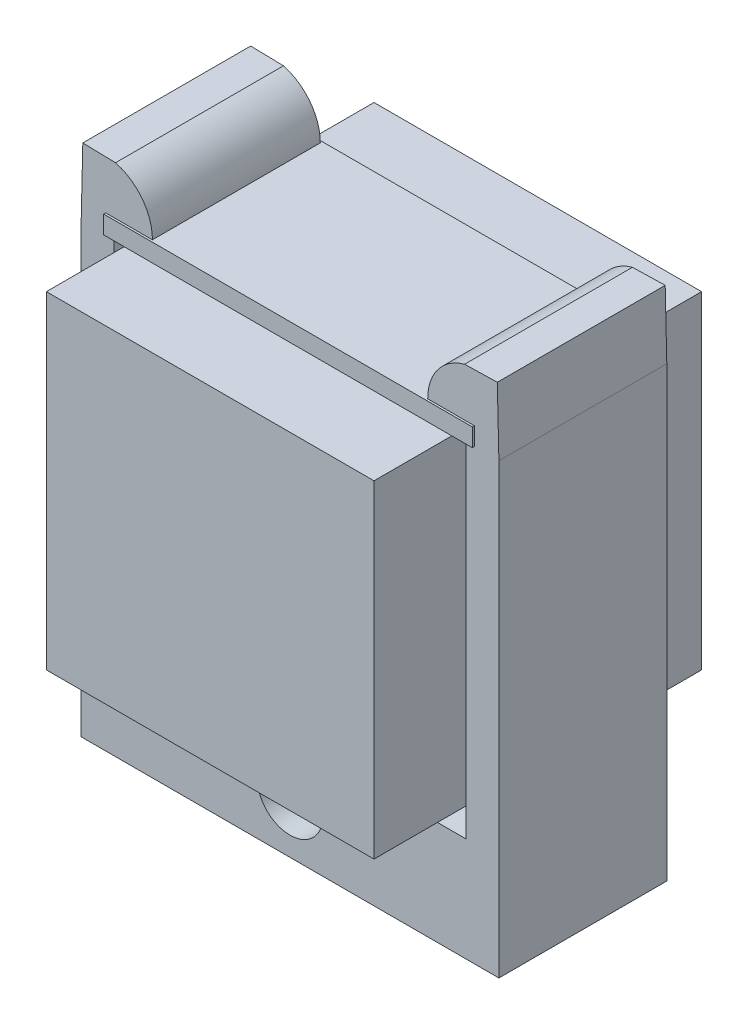
ISO-10303-21;
HEADER;
FILE_DESCRIPTION(('STEP AP214'),'2;1');
FILE_NAME('part.step','',(''),(''),'','','');
FILE_SCHEMA(('AUTOMOTIVE_DESIGN { 1 0 10303 214 1 1 1 1 }'));
ENDSEC;
DATA;
#1=APPLICATION_CONTEXT('core data for automotive mechanical design processes');
#2=APPLICATION_PROTOCOL_DEFINITION('international standard','automotive_design',2000,#1);
#3=PRODUCT_CONTEXT('',#1,'mechanical');
#4=PRODUCT('Part','Part','',(#3));
#5=PRODUCT_RELATED_PRODUCT_CATEGORY('part','',(#4));
#6=PRODUCT_DEFINITION_FORMATION('','',#4);
#7=PRODUCT_DEFINITION_CONTEXT('part definition',#1,'design');
#8=PRODUCT_DEFINITION('design','',#6,#7);
#9=PRODUCT_DEFINITION_SHAPE('','',#8);
#10=(LENGTH_UNIT() NAMED_UNIT(*) SI_UNIT(.MILLI.,.METRE.));
#11=(NAMED_UNIT(*) PLANE_ANGLE_UNIT() SI_UNIT($,.RADIAN.));
#12=(NAMED_UNIT(*) SI_UNIT($,.STERADIAN.) SOLID_ANGLE_UNIT());
#13=UNCERTAINTY_MEASURE_WITH_UNIT(LENGTH_MEASURE(1.E-05),#10,'distance_accuracy_value','');
#14=(GEOMETRIC_REPRESENTATION_CONTEXT(3) GLOBAL_UNCERTAINTY_ASSIGNED_CONTEXT((#13)) GLOBAL_UNIT_ASSIGNED_CONTEXT((#10,
#11,#12)) REPRESENTATION_CONTEXT('',''));
#15=CARTESIAN_POINT('',(0.,0.,0.));
#16=DIRECTION('',(0.,0.,1.));
#17=DIRECTION('',(1.,0.,0.));
#18=AXIS2_PLACEMENT_3D('',#15,#16,#17);
#19=CARTESIAN_POINT('',(-22.8808210284441,2.23350018556867,10.25));
#20=DIRECTION('',(0.,0.,-1.));
#21=DIRECTION('',(-1.,0.,0.));
#22=AXIS2_PLACEMENT_3D('',#19,#20,#21);
#23=CYLINDRICAL_SURFACE('',#22,6.07659216068548);
#24=CARTESIAN_POINT('',(-22.8808210284441,2.23350018556867,-10.25));
#25=DIRECTION('',(0.,0.,1.));
#26=DIRECTION('',(1.,0.,0.));
#27=AXIS2_PLACEMENT_3D('',#24,#25,#26);
#28=CIRCLE('',#27,6.07659216068548);
#29=CARTESIAN_POINT('',(-21.3059505258639,8.10246561291676,-10.25));
#30=VERTEX_POINT('',#29);
#31=CARTESIAN_POINT('',(-16.8059505258639,2.0888604116977,-10.25));
#32=VERTEX_POINT('',#31);
#33=EDGE_CURVE('E200',#30,#32,#28,.F.);
#34=ORIENTED_EDGE('',*,*,#33,.F.);
#35=DIRECTION('',(0.,0.,-1.));
#36=VECTOR('',#35,1.);
#37=CARTESIAN_POINT('',(-21.3059505258639,8.10246561291676,10.25));
#38=LINE('',#37,#36);
#39=CARTESIAN_POINT('',(-21.3059505258639,8.10246561291676,10.25));
#40=VERTEX_POINT('',#39);
#41=EDGE_CURVE('E12',#40,#30,#38,.T.);
#42=ORIENTED_EDGE('',*,*,#41,.F.);
#43=CARTESIAN_POINT('',(-22.8808210284441,2.23350018556867,10.25));
#44=DIRECTION('',(0.,0.,1.));
#45=DIRECTION('',(1.,0.,0.));
#46=AXIS2_PLACEMENT_3D('',#43,#44,#45);
#47=CIRCLE('',#46,6.07659216068548);
#48=CARTESIAN_POINT('',(-16.8059505258639,2.0888604116977,10.25));
#49=VERTEX_POINT('',#48);
#50=EDGE_CURVE('E243',#40,#49,#47,.F.);
#51=ORIENTED_EDGE('',*,*,#50,.T.);
#52=DIRECTION('',(0.,0.,-1.));
#53=VECTOR('',#52,1.);
#54=CARTESIAN_POINT('',(-16.8059505258639,2.0888604116977,10.25));
#55=LINE('',#54,#53);
#56=EDGE_CURVE('E71',#49,#32,#55,.T.);
#57=ORIENTED_EDGE('',*,*,#56,.T.);
#58=EDGE_LOOP('',(#34,#42,#51,#57));
#59=FACE_BOUND('',#58,.T.);
#60=ADVANCED_FACE('F55',(#59),#23,.T.);
#61=CARTESIAN_POINT('',(0.180735187091589,7.59087785784636,10.25));
#62=DIRECTION('',(0.0238027779462901,0.999716673744136,0.));
#63=DIRECTION('',(-0.999716673744136,0.0238027779462901,0.));
#64=AXIS2_PLACEMENT_3D('',#61,#62,#63);
#65=PLANE('',#64);
#66=DIRECTION('',(0.999716673744136,-0.0238027779462901,0.));
#67=VECTOR('',#66,1.);
#68=CARTESIAN_POINT('',(0.180735187091589,7.59087785784636,-10.25));
#69=LINE('',#68,#67);
#70=CARTESIAN_POINT('',(-25.3048172208404,8.19767672470191,-10.25));
#71=VERTEX_POINT('',#70);
#72=EDGE_CURVE('E202',#71,#30,#69,.T.);
#73=ORIENTED_EDGE('',*,*,#72,.F.);
#74=DIRECTION('',(0.,0.,-1.));
#75=VECTOR('',#74,1.);
#76=CARTESIAN_POINT('',(-25.3048172208404,8.19767672470191,10.25));
#77=LINE('',#76,#75);
#78=CARTESIAN_POINT('',(-25.3048172208404,8.19767672470191,10.25));
#79=VERTEX_POINT('',#78);
#80=EDGE_CURVE('E63',#79,#71,#77,.T.);
#81=ORIENTED_EDGE('',*,*,#80,.F.);
#82=DIRECTION('',(0.999716673744136,-0.0238027779462901,0.));
#83=VECTOR('',#82,1.);
#84=CARTESIAN_POINT('',(0.180735187091589,7.59087785784636,10.25));
#85=LINE('',#84,#83);
#86=EDGE_CURVE('E294',#79,#40,#85,.T.);
#87=ORIENTED_EDGE('',*,*,#86,.T.);
#88=ORIENTED_EDGE('',*,*,#41,.T.);
#89=EDGE_LOOP('',(#73,#81,#87,#88));
#90=FACE_BOUND('',#89,.T.);
#91=ADVANCED_FACE('F280',(#90),#65,.T.);
#92=CARTESIAN_POINT('',(-25.485552407932,0.606798866855565,10.25));
#93=DIRECTION('',(-0.999716673744136,0.0238027779462906,0.));
#94=DIRECTION('',(-0.0238027779462906,-0.999716673744136,0.));
#95=AXIS2_PLACEMENT_3D('',#92,#93,#94);
#96=PLANE('',#95);
#97=DIRECTION('',(0.0238027779462906,0.999716673744136,0.));
#98=VECTOR('',#97,1.);
#99=CARTESIAN_POINT('',(-25.485552407932,0.606798866855565,-10.25));
#100=LINE('',#99,#98);
#101=CARTESIAN_POINT('',(-25.5,0.,-10.25));
#102=VERTEX_POINT('',#101);
#103=EDGE_CURVE('E205',#102,#71,#100,.T.);
#104=ORIENTED_EDGE('',*,*,#103,.F.);
#105=DIRECTION('',(0.,0.,-1.));
#106=VECTOR('',#105,1.);
#107=CARTESIAN_POINT('',(-25.5,0.,10.25));
#108=LINE('',#107,#106);
#109=CARTESIAN_POINT('',(-25.5,0.,10.25));
#110=VERTEX_POINT('',#109);
#111=EDGE_CURVE('E269',#110,#102,#108,.T.);
#112=ORIENTED_EDGE('',*,*,#111,.F.);
#113=DIRECTION('',(0.0238027779462906,0.999716673744136,0.));
#114=VECTOR('',#113,1.);
#115=CARTESIAN_POINT('',(-25.485552407932,0.606798866855565,10.25));
#116=LINE('',#115,#114);
#117=EDGE_CURVE('E276',#110,#79,#116,.T.);
#118=ORIENTED_EDGE('',*,*,#117,.T.);
#119=ORIENTED_EDGE('',*,*,#80,.T.);
#120=EDGE_LOOP('',(#104,#112,#118,#119));
#121=FACE_BOUND('',#120,.T.);
#122=ADVANCED_FACE('F274',(#121),#96,.T.);
#123=CARTESIAN_POINT('',(-25.5,0.,10.25));
#124=DIRECTION('',(-1.,0.,0.));
#125=DIRECTION('',(0.,0.,1.));
#126=AXIS2_PLACEMENT_3D('',#123,#124,#125);
#127=PLANE('',#126);
#128=DIRECTION('',(0.,1.,0.));
#129=VECTOR('',#128,1.);
#130=CARTESIAN_POINT('',(-25.5,0.,-10.25));
#131=LINE('',#130,#129);
#132=CARTESIAN_POINT('',(-25.5,-54.7,-10.25));
#133=VERTEX_POINT('',#132);
#134=EDGE_CURVE('E208',#133,#102,#131,.T.);
#135=ORIENTED_EDGE('',*,*,#134,.F.);
#136=DIRECTION('',(0.,0.,-1.));
#137=VECTOR('',#136,1.);
#138=CARTESIAN_POINT('',(-25.5,-54.7,10.25));
#139=LINE('',#138,#137);
#140=CARTESIAN_POINT('',(-25.5,-54.7,10.25));
#141=VERTEX_POINT('',#140);
#142=EDGE_CURVE('E267',#141,#133,#139,.T.);
#143=ORIENTED_EDGE('',*,*,#142,.F.);
#144=DIRECTION('',(0.,1.,0.));
#145=VECTOR('',#144,1.);
#146=CARTESIAN_POINT('',(-25.5,0.,10.25));
#147=LINE('',#146,#145);
#148=EDGE_CURVE('E291',#141,#110,#147,.T.);
#149=ORIENTED_EDGE('',*,*,#148,.T.);
#150=ORIENTED_EDGE('',*,*,#111,.T.);
#151=EDGE_LOOP('',(#135,#143,#149,#150));
#152=FACE_BOUND('',#151,.T.);
#153=ADVANCED_FACE('F288',(#152),#127,.T.);
#154=CARTESIAN_POINT('',(0.,-54.7,10.25));
#155=DIRECTION('',(0.,-1.,0.));
#156=DIRECTION('',(0.,0.,-1.));
#157=AXIS2_PLACEMENT_3D('',#154,#155,#156);
#158=PLANE('',#157);
#159=DIRECTION('',(-1.,0.,0.));
#160=VECTOR('',#159,1.);
#161=CARTESIAN_POINT('',(0.,-54.7,-10.25));
#162=LINE('',#161,#160);
#163=CARTESIAN_POINT('',(25.5,-54.7,-10.25));
#164=VERTEX_POINT('',#163);
#165=EDGE_CURVE('E211',#164,#133,#162,.T.);
#166=ORIENTED_EDGE('',*,*,#165,.F.);
#167=DIRECTION('',(0.,0.,-1.));
#168=VECTOR('',#167,1.);
#169=CARTESIAN_POINT('',(25.5,-54.7,10.25));
#170=LINE('',#169,#168);
#171=CARTESIAN_POINT('',(25.5,-54.7,10.25));
#172=VERTEX_POINT('',#171);
#173=EDGE_CURVE('E265',#172,#164,#170,.T.);
#174=ORIENTED_EDGE('',*,*,#173,.F.);
#175=DIRECTION('',(-1.,0.,0.));
#176=VECTOR('',#175,1.);
#177=CARTESIAN_POINT('',(0.,-54.7,10.25));
#178=LINE('',#177,#176);
#179=EDGE_CURVE('E296',#172,#141,#178,.T.);
#180=ORIENTED_EDGE('',*,*,#179,.T.);
#181=ORIENTED_EDGE('',*,*,#142,.T.);
#182=EDGE_LOOP('',(#166,#174,#180,#181));
#183=FACE_BOUND('',#182,.T.);
#184=ADVANCED_FACE('F343',(#183),#158,.T.);
#185=CARTESIAN_POINT('',(25.5,0.,10.25));
#186=DIRECTION('',(-1.,0.,0.));
#187=DIRECTION('',(0.,0.,1.));
#188=AXIS2_PLACEMENT_3D('',#185,#186,#187);
#189=PLANE('',#188);
#190=DIRECTION('',(0.,1.,0.));
#191=VECTOR('',#190,1.);
#192=CARTESIAN_POINT('',(25.5,0.,-10.25));
#193=LINE('',#192,#191);
#194=CARTESIAN_POINT('',(25.5,0.,-10.25));
#195=VERTEX_POINT('',#194);
#196=EDGE_CURVE('E214',#164,#195,#193,.T.);
#197=ORIENTED_EDGE('',*,*,#196,.T.);
#198=DIRECTION('',(0.,0.,-1.));
#199=VECTOR('',#198,1.);
#200=CARTESIAN_POINT('',(25.5,0.,10.25));
#201=LINE('',#200,#199);
#202=CARTESIAN_POINT('',(25.5,0.,10.25));
#203=VERTEX_POINT('',#202);
#204=EDGE_CURVE('E262',#203,#195,#201,.T.);
#205=ORIENTED_EDGE('',*,*,#204,.F.);
#206=DIRECTION('',(0.,1.,0.));
#207=VECTOR('',#206,1.);
#208=CARTESIAN_POINT('',(25.5,0.,10.25));
#209=LINE('',#208,#207);
#210=EDGE_CURVE('E302',#172,#203,#209,.T.);
#211=ORIENTED_EDGE('',*,*,#210,.F.);
#212=ORIENTED_EDGE('',*,*,#173,.T.);
#213=EDGE_LOOP('',(#197,#205,#211,#212));
#214=FACE_BOUND('',#213,.T.);
#215=ADVANCED_FACE('F346',(#214),#189,.F.);
#216=CARTESIAN_POINT('',(25.485552407932,0.606798866855565,10.25));
#217=DIRECTION('',(-0.999716673744136,-0.0238027779462906,0.));
#218=DIRECTION('',(0.0238027779462906,-0.999716673744136,0.));
#219=AXIS2_PLACEMENT_3D('',#216,#217,#218);
#220=PLANE('',#219);
#221=DIRECTION('',(-0.0238027779462906,0.999716673744136,0.));
#222=VECTOR('',#221,1.);
#223=CARTESIAN_POINT('',(25.485552407932,0.606798866855565,-10.25));
#224=LINE('',#223,#222);
#225=CARTESIAN_POINT('',(25.3048172208404,8.19767672470191,-10.25));
#226=VERTEX_POINT('',#225);
#227=EDGE_CURVE('E216',#195,#226,#224,.T.);
#228=ORIENTED_EDGE('',*,*,#227,.T.);
#229=DIRECTION('',(0.,0.,-1.));
#230=VECTOR('',#229,1.);
#231=CARTESIAN_POINT('',(25.3048172208404,8.19767672470191,10.25));
#232=LINE('',#231,#230);
#233=CARTESIAN_POINT('',(25.3048172208404,8.19767672470191,10.25));
#234=VERTEX_POINT('',#233);
#235=EDGE_CURVE('E259',#234,#226,#232,.T.);
#236=ORIENTED_EDGE('',*,*,#235,.F.);
#237=DIRECTION('',(-0.0238027779462906,0.999716673744136,0.));
#238=VECTOR('',#237,1.);
#239=CARTESIAN_POINT('',(25.485552407932,0.606798866855565,10.25));
#240=LINE('',#239,#238);
#241=EDGE_CURVE('E304',#203,#234,#240,.T.);
#242=ORIENTED_EDGE('',*,*,#241,.F.);
#243=ORIENTED_EDGE('',*,*,#204,.T.);
#244=EDGE_LOOP('',(#228,#236,#242,#243));
#245=FACE_BOUND('',#244,.T.);
#246=ADVANCED_FACE('F350',(#245),#220,.F.);
#247=CARTESIAN_POINT('',(-0.180735187091589,7.59087785784636,10.25));
#248=DIRECTION('',(0.0238027779462901,-0.999716673744136,0.));
#249=DIRECTION('',(0.999716673744136,0.0238027779462901,0.));
#250=AXIS2_PLACEMENT_3D('',#247,#248,#249);
#251=PLANE('',#250);
#252=DIRECTION('',(-0.999716673744136,-0.0238027779462901,0.));
#253=VECTOR('',#252,1.);
#254=CARTESIAN_POINT('',(-0.180735187091589,7.59087785784636,-10.25));
#255=LINE('',#254,#253);
#256=CARTESIAN_POINT('',(21.3059505258639,8.10246561291676,-10.25));
#257=VERTEX_POINT('',#256);
#258=EDGE_CURVE('E218',#226,#257,#255,.T.);
#259=ORIENTED_EDGE('',*,*,#258,.T.);
#260=DIRECTION('',(0.,0.,-1.));
#261=VECTOR('',#260,1.);
#262=CARTESIAN_POINT('',(21.3059505258639,8.10246561291676,10.25));
#263=LINE('',#262,#261);
#264=CARTESIAN_POINT('',(21.3059505258639,8.10246561291676,10.25));
#265=VERTEX_POINT('',#264);
#266=EDGE_CURVE('E256',#265,#257,#263,.T.);
#267=ORIENTED_EDGE('',*,*,#266,.F.);
#268=DIRECTION('',(-0.999716673744136,-0.0238027779462901,0.));
#269=VECTOR('',#268,1.);
#270=CARTESIAN_POINT('',(-0.180735187091589,7.59087785784636,10.25));
#271=LINE('',#270,#269);
#272=EDGE_CURVE('E306',#234,#265,#271,.T.);
#273=ORIENTED_EDGE('',*,*,#272,.F.);
#274=ORIENTED_EDGE('',*,*,#235,.T.);
#275=EDGE_LOOP('',(#259,#267,#273,#274));
#276=FACE_BOUND('',#275,.T.);
#277=ADVANCED_FACE('F354',(#276),#251,.F.);
#278=CARTESIAN_POINT('',(22.8808210284441,2.23350018556867,10.25));
#279=DIRECTION('',(0.,0.,-1.));
#280=DIRECTION('',(-1.,0.,0.));
#281=AXIS2_PLACEMENT_3D('',#278,#279,#280);
#282=CYLINDRICAL_SURFACE('',#281,6.07659216068548);
#283=CARTESIAN_POINT('',(22.8808210284441,2.23350018556867,-10.25));
#284=DIRECTION('',(0.,0.,1.));
#285=DIRECTION('',(1.,0.,0.));
#286=AXIS2_PLACEMENT_3D('',#283,#284,#285);
#287=CIRCLE('',#286,6.07659216068548);
#288=CARTESIAN_POINT('',(16.8059505258639,2.0888604116977,-10.25));
#289=VERTEX_POINT('',#288);
#290=EDGE_CURVE('E220',#257,#289,#287,.T.);
#291=ORIENTED_EDGE('',*,*,#290,.T.);
#292=DIRECTION('',(0.,0.,-1.));
#293=VECTOR('',#292,1.);
#294=CARTESIAN_POINT('',(16.8059505258639,2.0888604116977,10.25));
#295=LINE('',#294,#293);
#296=CARTESIAN_POINT('',(16.8059505258639,2.0888604116977,10.25));
#297=VERTEX_POINT('',#296);
#298=EDGE_CURVE('E253',#297,#289,#295,.T.);
#299=ORIENTED_EDGE('',*,*,#298,.F.);
#300=CARTESIAN_POINT('',(22.8808210284441,2.23350018556867,10.25));
#301=DIRECTION('',(0.,0.,1.));
#302=DIRECTION('',(1.,0.,0.));
#303=AXIS2_PLACEMENT_3D('',#300,#301,#302);
#304=CIRCLE('',#303,6.07659216068548);
#305=EDGE_CURVE('E308',#265,#297,#304,.T.);
#306=ORIENTED_EDGE('',*,*,#305,.F.);
#307=ORIENTED_EDGE('',*,*,#266,.T.);
#308=EDGE_LOOP('',(#291,#299,#306,#307));
#309=FACE_BOUND('',#308,.T.);
#310=ADVANCED_FACE('F358',(#309),#282,.T.);
#311=CARTESIAN_POINT('',(-0.0401848083656906,1.68776195135887,10.25));
#312=DIRECTION('',(-0.0238027779462908,0.999716673744136,0.));
#313=DIRECTION('',(-0.999716673744136,-0.0238027779462908,0.));
#314=AXIS2_PLACEMENT_3D('',#311,#312,#313);
#315=PLANE('',#314);
#316=DIRECTION('',(0.999716673744136,0.0238027779462908,0.));
#317=VECTOR('',#316,1.);
#318=CARTESIAN_POINT('',(-0.0401848083656906,1.68776195135887,-10.25));
#319=LINE('',#318,#317);
#320=CARTESIAN_POINT('',(21.4476338885182,2.1993766822371,-10.25));
#321=VERTEX_POINT('',#320);
#322=EDGE_CURVE('E222',#289,#321,#319,.T.);
#323=ORIENTED_EDGE('',*,*,#322,.T.);
#324=DIRECTION('',(0.,0.,-1.));
#325=VECTOR('',#324,1.);
#326=CARTESIAN_POINT('',(21.4476338885182,2.1993766822371,10.25));
#327=LINE('',#326,#325);
#328=CARTESIAN_POINT('',(21.4476338885182,2.1993766822371,10.25));
#329=VERTEX_POINT('',#328);
#330=EDGE_CURVE('E251',#329,#321,#327,.T.);
#331=ORIENTED_EDGE('',*,*,#330,.F.);
#332=DIRECTION('',(0.999716673744136,0.0238027779462908,0.));
#333=VECTOR('',#332,1.);
#334=CARTESIAN_POINT('',(-0.0401848083656906,1.68776195135887,10.25));
#335=LINE('',#334,#333);
#336=EDGE_CURVE('E310',#297,#329,#335,.T.);
#337=ORIENTED_EDGE('',*,*,#336,.F.);
#338=ORIENTED_EDGE('',*,*,#298,.T.);
#339=EDGE_LOOP('',(#323,#331,#337,#338));
#340=FACE_BOUND('',#339,.T.);
#341=ADVANCED_FACE('F362',(#340),#315,.F.);
#342=CARTESIAN_POINT('',(21.4878186968839,0.511614730878188,10.25));
#343=DIRECTION('',(-0.999716673744136,-0.023802777946289,0.));
#344=DIRECTION('',(0.023802777946289,-0.999716673744136,0.));
#345=AXIS2_PLACEMENT_3D('',#342,#343,#344);
#346=PLANE('',#345);
#347=DIRECTION('',(-0.023802777946289,0.999716673744136,0.));
#348=VECTOR('',#347,1.);
#349=CARTESIAN_POINT('',(21.4878186968839,0.511614730878188,-10.25));
#350=LINE('',#349,#348);
#351=CARTESIAN_POINT('',(21.5,0.,-10.25));
#352=VERTEX_POINT('',#351);
#353=EDGE_CURVE('E225',#352,#321,#350,.T.);
#354=ORIENTED_EDGE('',*,*,#353,.F.);
#355=DIRECTION('',(0.,0.,-1.));
#356=VECTOR('',#355,1.);
#357=CARTESIAN_POINT('',(21.5,0.,10.25));
#358=LINE('',#357,#356);
#359=CARTESIAN_POINT('',(21.5,0.,10.25));
#360=VERTEX_POINT('',#359);
#361=EDGE_CURVE('E249',#360,#352,#358,.T.);
#362=ORIENTED_EDGE('',*,*,#361,.F.);
#363=DIRECTION('',(-0.023802777946289,0.999716673744136,0.));
#364=VECTOR('',#363,1.);
#365=CARTESIAN_POINT('',(21.4878186968839,0.511614730878188,10.25));
#366=LINE('',#365,#364);
#367=EDGE_CURVE('E312',#360,#329,#366,.T.);
#368=ORIENTED_EDGE('',*,*,#367,.T.);
#369=ORIENTED_EDGE('',*,*,#330,.T.);
#370=EDGE_LOOP('',(#354,#362,#368,#369));
#371=FACE_BOUND('',#370,.T.);
#372=ADVANCED_FACE('F366',(#371),#346,.T.);
#373=CARTESIAN_POINT('',(21.5,0.,10.25));
#374=DIRECTION('',(-1.,0.,0.));
#375=DIRECTION('',(0.,0.,1.));
#376=AXIS2_PLACEMENT_3D('',#373,#374,#375);
#377=PLANE('',#376);
#378=DIRECTION('',(0.,1.,0.));
#379=VECTOR('',#378,1.);
#380=CARTESIAN_POINT('',(21.5,0.,-10.25));
#381=LINE('',#380,#379);
#382=CARTESIAN_POINT('',(21.5,-42.,-10.25));
#383=VERTEX_POINT('',#382);
#384=EDGE_CURVE('E228',#383,#352,#381,.T.);
#385=ORIENTED_EDGE('',*,*,#384,.F.);
#386=DIRECTION('',(0.,0.,-1.));
#387=VECTOR('',#386,1.);
#388=CARTESIAN_POINT('',(21.5,-42.,10.25));
#389=LINE('',#388,#387);
#390=CARTESIAN_POINT('',(21.5,-42.,10.25));
#391=VERTEX_POINT('',#390);
#392=EDGE_CURVE('E247',#391,#383,#389,.T.);
#393=ORIENTED_EDGE('',*,*,#392,.F.);
#394=DIRECTION('',(0.,1.,0.));
#395=VECTOR('',#394,1.);
#396=CARTESIAN_POINT('',(21.5,0.,10.25));
#397=LINE('',#396,#395);
#398=EDGE_CURVE('E315',#391,#360,#397,.T.);
#399=ORIENTED_EDGE('',*,*,#398,.T.);
#400=ORIENTED_EDGE('',*,*,#361,.T.);
#401=EDGE_LOOP('',(#385,#393,#399,#400));
#402=FACE_BOUND('',#401,.T.);
#403=ADVANCED_FACE('F370',(#402),#377,.T.);
#404=CARTESIAN_POINT('',(0.,-42.,10.25));
#405=DIRECTION('',(0.,1.,0.));
#406=DIRECTION('',(0.,0.,1.));
#407=AXIS2_PLACEMENT_3D('',#404,#405,#406);
#408=PLANE('',#407);
#409=DIRECTION('',(1.,0.,0.));
#410=VECTOR('',#409,1.);
#411=CARTESIAN_POINT('',(0.,-42.,-10.25));
#412=LINE('',#411,#410);
#413=CARTESIAN_POINT('',(-21.5,-42.,-10.25));
#414=VERTEX_POINT('',#413);
#415=EDGE_CURVE('E231',#414,#383,#412,.T.);
#416=ORIENTED_EDGE('',*,*,#415,.F.);
#417=DIRECTION('',(0.,0.,-1.));
#418=VECTOR('',#417,1.);
#419=CARTESIAN_POINT('',(-21.5,-42.,10.25));
#420=LINE('',#419,#418);
#421=CARTESIAN_POINT('',(-21.5,-42.,10.25));
#422=VERTEX_POINT('',#421);
#423=EDGE_CURVE('E189',#422,#414,#420,.T.);
#424=ORIENTED_EDGE('',*,*,#423,.F.);
#425=DIRECTION('',(1.,0.,0.));
#426=VECTOR('',#425,1.);
#427=CARTESIAN_POINT('',(0.,-42.,10.25));
#428=LINE('',#427,#426);
#429=EDGE_CURVE('E179',#422,#391,#428,.T.);
#430=ORIENTED_EDGE('',*,*,#429,.T.);
#431=ORIENTED_EDGE('',*,*,#392,.T.);
#432=EDGE_LOOP('',(#416,#424,#430,#431));
#433=FACE_BOUND('',#432,.T.);
#434=ADVANCED_FACE('F319',(#433),#408,.T.);
#435=CARTESIAN_POINT('',(-21.5,0.,10.25));
#436=DIRECTION('',(-1.,0.,0.));
#437=DIRECTION('',(0.,0.,1.));
#438=AXIS2_PLACEMENT_3D('',#435,#436,#437);
#439=PLANE('',#438);
#440=DIRECTION('',(0.,1.,0.));
#441=VECTOR('',#440,1.);
#442=CARTESIAN_POINT('',(-21.5,0.,-10.25));
#443=LINE('',#442,#441);
#444=CARTESIAN_POINT('',(-21.5,0.,-10.25));
#445=VERTEX_POINT('',#444);
#446=EDGE_CURVE('E186',#414,#445,#443,.T.);
#447=ORIENTED_EDGE('',*,*,#446,.T.);
#448=DIRECTION('',(0.,0.,-1.));
#449=VECTOR('',#448,1.);
#450=CARTESIAN_POINT('',(-21.5,0.,10.25));
#451=LINE('',#450,#449);
#452=CARTESIAN_POINT('',(-21.5,0.,10.25));
#453=VERTEX_POINT('',#452);
#454=EDGE_CURVE('E183',#453,#445,#451,.T.);
#455=ORIENTED_EDGE('',*,*,#454,.F.);
#456=DIRECTION('',(0.,1.,0.));
#457=VECTOR('',#456,1.);
#458=CARTESIAN_POINT('',(-21.5,0.,10.25));
#459=LINE('',#458,#457);
#460=EDGE_CURVE('E170',#422,#453,#459,.T.);
#461=ORIENTED_EDGE('',*,*,#460,.F.);
#462=ORIENTED_EDGE('',*,*,#423,.T.);
#463=EDGE_LOOP('',(#447,#455,#461,#462));
#464=FACE_BOUND('',#463,.T.);
#465=ADVANCED_FACE('F184',(#464),#439,.F.);
#466=CARTESIAN_POINT('',(-21.4878186968839,0.511614730878188,10.25));
#467=DIRECTION('',(-0.999716673744136,0.023802777946289,0.));
#468=DIRECTION('',(-0.023802777946289,-0.999716673744136,0.));
#469=AXIS2_PLACEMENT_3D('',#466,#467,#468);
#470=PLANE('',#469);
#471=DIRECTION('',(0.023802777946289,0.999716673744136,0.));
#472=VECTOR('',#471,1.);
#473=CARTESIAN_POINT('',(-21.4878186968839,0.511614730878188,-10.25));
#474=LINE('',#473,#472);
#475=CARTESIAN_POINT('',(-21.4476338885182,2.1993766822371,-10.25));
#476=VERTEX_POINT('',#475);
#477=EDGE_CURVE('E235',#445,#476,#474,.T.);
#478=ORIENTED_EDGE('',*,*,#477,.T.);
#479=DIRECTION('',(0.,0.,-1.));
#480=VECTOR('',#479,1.);
#481=CARTESIAN_POINT('',(-21.4476338885182,2.1993766822371,10.25));
#482=LINE('',#481,#480);
#483=CARTESIAN_POINT('',(-21.4476338885182,2.1993766822371,10.25));
#484=VERTEX_POINT('',#483);
#485=EDGE_CURVE('E121',#484,#476,#482,.T.);
#486=ORIENTED_EDGE('',*,*,#485,.F.);
#487=DIRECTION('',(0.023802777946289,0.999716673744136,0.));
#488=VECTOR('',#487,1.);
#489=CARTESIAN_POINT('',(-21.4878186968839,0.511614730878188,10.25));
#490=LINE('',#489,#488);
#491=EDGE_CURVE('E176',#453,#484,#490,.T.);
#492=ORIENTED_EDGE('',*,*,#491,.F.);
#493=ORIENTED_EDGE('',*,*,#454,.T.);
#494=EDGE_LOOP('',(#478,#486,#492,#493));
#495=FACE_BOUND('',#494,.T.);
#496=ADVANCED_FACE('F191',(#495),#470,.F.);
#497=CARTESIAN_POINT('',(0.0401848083656906,1.68776195135887,10.25));
#498=DIRECTION('',(-0.0238027779462908,-0.999716673744136,0.));
#499=DIRECTION('',(0.999716673744136,-0.0238027779462908,0.));
#500=AXIS2_PLACEMENT_3D('',#497,#498,#499);
#501=PLANE('',#500);
#502=DIRECTION('',(-0.999716673744136,0.0238027779462908,0.));
#503=VECTOR('',#502,1.);
#504=CARTESIAN_POINT('',(0.0401848083656906,1.68776195135887,-10.25));
#505=LINE('',#504,#503);
#506=EDGE_CURVE('E237',#32,#476,#505,.T.);
#507=ORIENTED_EDGE('',*,*,#506,.F.);
#508=ORIENTED_EDGE('',*,*,#56,.F.);
#509=DIRECTION('',(-0.999716673744136,0.0238027779462908,0.));
#510=VECTOR('',#509,1.);
#511=CARTESIAN_POINT('',(0.0401848083656906,1.68776195135887,10.25));
#512=LINE('',#511,#510);
#513=EDGE_CURVE('E192',#49,#484,#512,.T.);
#514=ORIENTED_EDGE('',*,*,#513,.T.);
#515=ORIENTED_EDGE('',*,*,#485,.T.);
#516=EDGE_LOOP('',(#507,#508,#514,#515));
#517=FACE_BOUND('',#516,.T.);
#518=ADVANCED_FACE('F321',(#517),#501,.T.);
#519=CARTESIAN_POINT('',(0.,-48.35,10.25));
#520=DIRECTION('',(0.,0.,-1.));
#521=DIRECTION('',(-1.,0.,0.));
#522=AXIS2_PLACEMENT_3D('',#519,#520,#521);
#523=CYLINDRICAL_SURFACE('',#522,4.);
#524=CARTESIAN_POINT('',(0.,-48.35,10.25));
#525=DIRECTION('',(0.,0.,1.));
#526=DIRECTION('',(1.,0.,0.));
#527=AXIS2_PLACEMENT_3D('',#524,#525,#526);
#528=CIRCLE('',#527,4.);
#529=CARTESIAN_POINT('',(4.,-48.35,10.25));
#530=VERTEX_POINT('',#529);
#531=EDGE_CURVE('E194',#530,#530,#528,.T.);
#532=ORIENTED_EDGE('',*,*,#531,.T.);
#533=EDGE_LOOP('',(#532));
#534=FACE_BOUND('',#533,.T.);
#535=CARTESIAN_POINT('',(0.,-48.35,-10.25));
#536=DIRECTION('',(0.,0.,1.));
#537=DIRECTION('',(1.,0.,0.));
#538=AXIS2_PLACEMENT_3D('',#535,#536,#537);
#539=CIRCLE('',#538,4.);
#540=CARTESIAN_POINT('',(4.,-48.35,-10.25));
#541=VERTEX_POINT('',#540);
#542=EDGE_CURVE('E240',#541,#541,#539,.T.);
#543=ORIENTED_EDGE('',*,*,#542,.F.);
#544=EDGE_LOOP('',(#543));
#545=FACE_BOUND('',#544,.T.);
#546=ADVANCED_FACE('F323',(#534,#545),#523,.F.);
#547=CARTESIAN_POINT('',(0.,0.,10.25));
#548=DIRECTION('',(0.,0.,1.));
#549=DIRECTION('',(1.,0.,0.));
#550=AXIS2_PLACEMENT_3D('',#547,#548,#549);
#551=PLANE('',#550);
#552=ORIENTED_EDGE('',*,*,#50,.F.);
#553=ORIENTED_EDGE('',*,*,#86,.F.);
#554=ORIENTED_EDGE('',*,*,#117,.F.);
#555=ORIENTED_EDGE('',*,*,#148,.F.);
#556=ORIENTED_EDGE('',*,*,#179,.F.);
#557=ORIENTED_EDGE('',*,*,#210,.T.);
#558=ORIENTED_EDGE('',*,*,#241,.T.);
#559=ORIENTED_EDGE('',*,*,#272,.T.);
#560=ORIENTED_EDGE('',*,*,#305,.T.);
#561=ORIENTED_EDGE('',*,*,#336,.T.);
#562=ORIENTED_EDGE('',*,*,#367,.F.);
#563=ORIENTED_EDGE('',*,*,#398,.F.);
#564=ORIENTED_EDGE('',*,*,#429,.F.);
#565=ORIENTED_EDGE('',*,*,#460,.T.);
#566=ORIENTED_EDGE('',*,*,#491,.T.);
#567=ORIENTED_EDGE('',*,*,#513,.F.);
#568=EDGE_LOOP('',(#552,#553,#554,#555,#556,#557,#558,#559,#560,#561,#562,#563,#564,#565,#566,#567));
#569=FACE_BOUND('',#568,.T.);
#570=ORIENTED_EDGE('',*,*,#531,.F.);
#571=EDGE_LOOP('',(#570));
#572=FACE_BOUND('',#571,.T.);
#573=ADVANCED_FACE('F172',(#569,#572),#551,.T.);
#574=CARTESIAN_POINT('',(0.,0.,-10.25));
#575=DIRECTION('',(0.,0.,1.));
#576=DIRECTION('',(1.,0.,0.));
#577=AXIS2_PLACEMENT_3D('',#574,#575,#576);
#578=PLANE('',#577);
#579=ORIENTED_EDGE('',*,*,#33,.T.);
#580=ORIENTED_EDGE('',*,*,#506,.T.);
#581=ORIENTED_EDGE('',*,*,#477,.F.);
#582=ORIENTED_EDGE('',*,*,#446,.F.);
#583=ORIENTED_EDGE('',*,*,#415,.T.);
#584=ORIENTED_EDGE('',*,*,#384,.T.);
#585=ORIENTED_EDGE('',*,*,#353,.T.);
#586=ORIENTED_EDGE('',*,*,#322,.F.);
#587=ORIENTED_EDGE('',*,*,#290,.F.);
#588=ORIENTED_EDGE('',*,*,#258,.F.);
#589=ORIENTED_EDGE('',*,*,#227,.F.);
#590=ORIENTED_EDGE('',*,*,#196,.F.);
#591=ORIENTED_EDGE('',*,*,#165,.T.);
#592=ORIENTED_EDGE('',*,*,#134,.T.);
#593=ORIENTED_EDGE('',*,*,#103,.T.);
#594=ORIENTED_EDGE('',*,*,#72,.T.);
#595=EDGE_LOOP('',(#579,#580,#581,#582,#583,#584,#585,#586,#587,#588,#589,#590,#591,#592,#593,#594));
#596=FACE_BOUND('',#595,.T.);
#597=ORIENTED_EDGE('',*,*,#542,.T.);
#598=EDGE_LOOP('',(#597));
#599=FACE_BOUND('',#598,.T.);
#600=ADVANCED_FACE('F282',(#596,#599),#578,.F.);
#601=CLOSED_SHELL('',(#60,#91,#122,#153,#184,#215,#246,#277,#310,#341,#372,#403,#434,#465,#496,
#518,#546,#573,#600));
#602=MANIFOLD_SOLID_BREP('B2',#601);
#603=CARTESIAN_POINT('',(20.,-40.,20.));
#604=DIRECTION('',(1.,0.,0.));
#605=DIRECTION('',(0.,0.,-1.));
#606=AXIS2_PLACEMENT_3D('',#603,#604,#605);
#607=PLANE('',#606);
#608=DIRECTION('',(0.,0.,-1.));
#609=VECTOR('',#608,1.);
#610=CARTESIAN_POINT('',(20.,0.,20.));
#611=LINE('',#610,#609);
#612=CARTESIAN_POINT('',(20.,0.,20.));
#613=VERTEX_POINT('',#612);
#614=CARTESIAN_POINT('',(20.,0.,-20.));
#615=VERTEX_POINT('',#614);
#616=EDGE_CURVE('E652',#613,#615,#611,.T.);
#617=ORIENTED_EDGE('',*,*,#616,.F.);
#618=DIRECTION('',(0.,1.,0.));
#619=VECTOR('',#618,1.);
#620=CARTESIAN_POINT('',(20.,-40.,20.));
#621=LINE('',#620,#619);
#622=CARTESIAN_POINT('',(20.,-40.,20.));
#623=VERTEX_POINT('',#622);
#624=EDGE_CURVE('E53',#623,#613,#621,.T.);
#625=ORIENTED_EDGE('',*,*,#624,.F.);
#626=DIRECTION('',(0.,0.,-1.));
#627=VECTOR('',#626,1.);
#628=CARTESIAN_POINT('',(20.,-40.,20.));
#629=LINE('',#628,#627);
#630=CARTESIAN_POINT('',(20.,-40.,-20.));
#631=VERTEX_POINT('',#630);
#632=EDGE_CURVE('E644',#623,#631,#629,.T.);
#633=ORIENTED_EDGE('',*,*,#632,.T.);
#634=DIRECTION('',(0.,1.,0.));
#635=VECTOR('',#634,1.);
#636=CARTESIAN_POINT('',(20.,-40.,-20.));
#637=LINE('',#636,#635);
#638=EDGE_CURVE('E585',#631,#615,#637,.T.);
#639=ORIENTED_EDGE('',*,*,#638,.T.);
#640=EDGE_LOOP('',(#617,#625,#633,#639));
#641=FACE_BOUND('',#640,.T.);
#642=ADVANCED_FACE('F582',(#641),#607,.T.);
#643=CARTESIAN_POINT('',(-20.,-40.,20.));
#644=DIRECTION('',(0.,0.,1.));
#645=DIRECTION('',(1.,0.,0.));
#646=AXIS2_PLACEMENT_3D('',#643,#644,#645);
#647=PLANE('',#646);
#648=DIRECTION('',(1.,0.,0.));
#649=VECTOR('',#648,1.);
#650=CARTESIAN_POINT('',(-20.,0.,20.));
#651=LINE('',#650,#649);
#652=CARTESIAN_POINT('',(-20.,0.,20.));
#653=VERTEX_POINT('',#652);
#654=EDGE_CURVE('E647',#653,#613,#651,.T.);
#655=ORIENTED_EDGE('',*,*,#654,.F.);
#656=DIRECTION('',(0.,1.,0.));
#657=VECTOR('',#656,1.);
#658=CARTESIAN_POINT('',(-20.,-40.,20.));
#659=LINE('',#658,#657);
#660=CARTESIAN_POINT('',(-20.,-40.,20.));
#661=VERTEX_POINT('',#660);
#662=EDGE_CURVE('E592',#661,#653,#659,.T.);
#663=ORIENTED_EDGE('',*,*,#662,.F.);
#664=DIRECTION('',(1.,0.,0.));
#665=VECTOR('',#664,1.);
#666=CARTESIAN_POINT('',(-20.,-40.,20.));
#667=LINE('',#666,#665);
#668=EDGE_CURVE('E639',#661,#623,#667,.T.);
#669=ORIENTED_EDGE('',*,*,#668,.T.);
#670=ORIENTED_EDGE('',*,*,#624,.T.);
#671=EDGE_LOOP('',(#655,#663,#669,#670));
#672=FACE_BOUND('',#671,.T.);
#673=ADVANCED_FACE('F668',(#672),#647,.T.);
#674=CARTESIAN_POINT('',(-20.,-40.,20.));
#675=DIRECTION('',(-1.,0.,0.));
#676=DIRECTION('',(0.,0.,1.));
#677=AXIS2_PLACEMENT_3D('',#674,#675,#676);
#678=PLANE('',#677);
#679=DIRECTION('',(0.,0.,1.));
#680=VECTOR('',#679,1.);
#681=CARTESIAN_POINT('',(-20.,0.,20.));
#682=LINE('',#681,#680);
#683=CARTESIAN_POINT('',(-20.,0.,-20.));
#684=VERTEX_POINT('',#683);
#685=EDGE_CURVE('E633',#684,#653,#682,.T.);
#686=ORIENTED_EDGE('',*,*,#685,.F.);
#687=DIRECTION('',(0.,1.,0.));
#688=VECTOR('',#687,1.);
#689=CARTESIAN_POINT('',(-20.,-40.,-20.));
#690=LINE('',#689,#688);
#691=CARTESIAN_POINT('',(-20.,-40.,-20.));
#692=VERTEX_POINT('',#691);
#693=EDGE_CURVE('E628',#692,#684,#690,.T.);
#694=ORIENTED_EDGE('',*,*,#693,.F.);
#695=DIRECTION('',(0.,0.,1.));
#696=VECTOR('',#695,1.);
#697=CARTESIAN_POINT('',(-20.,-40.,20.));
#698=LINE('',#697,#696);
#699=EDGE_CURVE('E631',#692,#661,#698,.T.);
#700=ORIENTED_EDGE('',*,*,#699,.T.);
#701=ORIENTED_EDGE('',*,*,#662,.T.);
#702=EDGE_LOOP('',(#686,#694,#700,#701));
#703=FACE_BOUND('',#702,.T.);
#704=ADVANCED_FACE('F630',(#703),#678,.T.);
#705=CARTESIAN_POINT('',(-20.,-40.,-20.));
#706=DIRECTION('',(0.,0.,-1.));
#707=DIRECTION('',(-1.,0.,0.));
#708=AXIS2_PLACEMENT_3D('',#705,#706,#707);
#709=PLANE('',#708);
#710=DIRECTION('',(-1.,0.,0.));
#711=VECTOR('',#710,1.);
#712=CARTESIAN_POINT('',(-20.,0.,-20.));
#713=LINE('',#712,#711);
#714=EDGE_CURVE('E656',#615,#684,#713,.T.);
#715=ORIENTED_EDGE('',*,*,#714,.F.);
#716=ORIENTED_EDGE('',*,*,#638,.F.);
#717=DIRECTION('',(-1.,0.,0.));
#718=VECTOR('',#717,1.);
#719=CARTESIAN_POINT('',(-20.,-40.,-20.));
#720=LINE('',#719,#718);
#721=EDGE_CURVE('E638',#631,#692,#720,.T.);
#722=ORIENTED_EDGE('',*,*,#721,.T.);
#723=ORIENTED_EDGE('',*,*,#693,.T.);
#724=EDGE_LOOP('',(#715,#716,#722,#723));
#725=FACE_BOUND('',#724,.T.);
#726=ADVANCED_FACE('F642',(#725),#709,.T.);
#727=CARTESIAN_POINT('',(0.,-40.,0.));
#728=DIRECTION('',(0.,-1.,0.));
#729=DIRECTION('',(0.,0.,-1.));
#730=AXIS2_PLACEMENT_3D('',#727,#728,#729);
#731=PLANE('',#730);
#732=ORIENTED_EDGE('',*,*,#632,.F.);
#733=ORIENTED_EDGE('',*,*,#668,.F.);
#734=ORIENTED_EDGE('',*,*,#699,.F.);
#735=ORIENTED_EDGE('',*,*,#721,.F.);
#736=EDGE_LOOP('',(#732,#733,#734,#735));
#737=FACE_BOUND('',#736,.T.);
#738=ADVANCED_FACE('F637',(#737),#731,.T.);
#739=CARTESIAN_POINT('',(0.,0.,0.));
#740=DIRECTION('',(0.,-1.,0.));
#741=DIRECTION('',(0.,0.,-1.));
#742=AXIS2_PLACEMENT_3D('',#739,#740,#741);
#743=PLANE('',#742);
#744=ORIENTED_EDGE('',*,*,#616,.T.);
#745=ORIENTED_EDGE('',*,*,#714,.T.);
#746=ORIENTED_EDGE('',*,*,#685,.T.);
#747=ORIENTED_EDGE('',*,*,#654,.T.);
#748=EDGE_LOOP('',(#744,#745,#746,#747));
#749=FACE_BOUND('',#748,.T.);
#750=ADVANCED_FACE('F667',(#749),#743,.F.);
#751=CLOSED_SHELL('',(#642,#673,#704,#726,#738,#750));
#752=MANIFOLD_SOLID_BREP('B6',#751);
#753=CARTESIAN_POINT('',(22.5,2.2,10.5));
#754=DIRECTION('',(-1.,0.,0.));
#755=DIRECTION('',(0.,0.,1.));
#756=AXIS2_PLACEMENT_3D('',#753,#754,#755);
#757=PLANE('',#756);
#758=DIRECTION('',(0.,0.,-1.));
#759=VECTOR('',#758,1.);
#760=CARTESIAN_POINT('',(22.5,0.,10.5));
#761=LINE('',#760,#759);
#762=CARTESIAN_POINT('',(22.5,0.,10.5));
#763=VERTEX_POINT('',#762);
#764=CARTESIAN_POINT('',(22.5,0.,-10.5));
#765=VERTEX_POINT('',#764);
#766=EDGE_CURVE('E792',#763,#765,#761,.T.);
#767=ORIENTED_EDGE('',*,*,#766,.T.);
#768=DIRECTION('',(0.,-1.,0.));
#769=VECTOR('',#768,1.);
#770=CARTESIAN_POINT('',(22.5,2.2,-10.5));
#771=LINE('',#770,#769);
#772=CARTESIAN_POINT('',(22.5,2.2,-10.5));
#773=VERTEX_POINT('',#772);
#774=EDGE_CURVE('E580',#773,#765,#771,.T.);
#775=ORIENTED_EDGE('',*,*,#774,.F.);
#776=DIRECTION('',(0.,0.,-1.));
#777=VECTOR('',#776,1.);
#778=CARTESIAN_POINT('',(22.5,2.2,10.5));
#779=LINE('',#778,#777);
#780=CARTESIAN_POINT('',(22.5,2.2,10.5));
#781=VERTEX_POINT('',#780);
#782=EDGE_CURVE('E780',#781,#773,#779,.T.);
#783=ORIENTED_EDGE('',*,*,#782,.F.);
#784=DIRECTION('',(0.,-1.,0.));
#785=VECTOR('',#784,1.);
#786=CARTESIAN_POINT('',(22.5,2.2,10.5));
#787=LINE('',#786,#785);
#788=EDGE_CURVE('E788',#781,#763,#787,.T.);
#789=ORIENTED_EDGE('',*,*,#788,.T.);
#790=EDGE_LOOP('',(#767,#775,#783,#789));
#791=FACE_BOUND('',#790,.T.);
#792=ADVANCED_FACE('F729',(#791),#757,.F.);
#793=CARTESIAN_POINT('',(-22.5,2.2,-10.5));
#794=DIRECTION('',(0.,0.,1.));
#795=DIRECTION('',(1.,0.,0.));
#796=AXIS2_PLACEMENT_3D('',#793,#794,#795);
#797=PLANE('',#796);
#798=DIRECTION('',(-1.,0.,0.));
#799=VECTOR('',#798,1.);
#800=CARTESIAN_POINT('',(-22.5,0.,-10.5));
#801=LINE('',#800,#799);
#802=CARTESIAN_POINT('',(-22.5,0.,-10.5));
#803=VERTEX_POINT('',#802);
#804=EDGE_CURVE('E784',#765,#803,#801,.T.);
#805=ORIENTED_EDGE('',*,*,#804,.T.);
#806=DIRECTION('',(0.,-1.,0.));
#807=VECTOR('',#806,1.);
#808=CARTESIAN_POINT('',(-22.5,2.2,-10.5));
#809=LINE('',#808,#807);
#810=CARTESIAN_POINT('',(-22.5,2.2,-10.5));
#811=VERTEX_POINT('',#810);
#812=EDGE_CURVE('E737',#811,#803,#809,.T.);
#813=ORIENTED_EDGE('',*,*,#812,.F.);
#814=DIRECTION('',(-1.,0.,0.));
#815=VECTOR('',#814,1.);
#816=CARTESIAN_POINT('',(-22.5,2.2,-10.5));
#817=LINE('',#816,#815);
#818=EDGE_CURVE('E775',#773,#811,#817,.T.);
#819=ORIENTED_EDGE('',*,*,#818,.F.);
#820=ORIENTED_EDGE('',*,*,#774,.T.);
#821=EDGE_LOOP('',(#805,#813,#819,#820));
#822=FACE_BOUND('',#821,.T.);
#823=ADVANCED_FACE('F783',(#822),#797,.F.);
#824=CARTESIAN_POINT('',(-22.5,2.2,10.5));
#825=DIRECTION('',(1.,0.,0.));
#826=DIRECTION('',(0.,0.,-1.));
#827=AXIS2_PLACEMENT_3D('',#824,#825,#826);
#828=PLANE('',#827);
#829=DIRECTION('',(0.,0.,1.));
#830=VECTOR('',#829,1.);
#831=CARTESIAN_POINT('',(-22.5,0.,10.5));
#832=LINE('',#831,#830);
#833=CARTESIAN_POINT('',(-22.5,0.,10.5));
#834=VERTEX_POINT('',#833);
#835=EDGE_CURVE('E762',#803,#834,#832,.T.);
#836=ORIENTED_EDGE('',*,*,#835,.T.);
#837=DIRECTION('',(0.,-1.,0.));
#838=VECTOR('',#837,1.);
#839=CARTESIAN_POINT('',(-22.5,2.2,10.5));
#840=LINE('',#839,#838);
#841=CARTESIAN_POINT('',(-22.5,2.2,10.5));
#842=VERTEX_POINT('',#841);
#843=EDGE_CURVE('E785',#842,#834,#840,.T.);
#844=ORIENTED_EDGE('',*,*,#843,.F.);
#845=DIRECTION('',(0.,0.,1.));
#846=VECTOR('',#845,1.);
#847=CARTESIAN_POINT('',(-22.5,2.2,10.5));
#848=LINE('',#847,#846);
#849=EDGE_CURVE('E778',#811,#842,#848,.T.);
#850=ORIENTED_EDGE('',*,*,#849,.F.);
#851=ORIENTED_EDGE('',*,*,#812,.T.);
#852=EDGE_LOOP('',(#836,#844,#850,#851));
#853=FACE_BOUND('',#852,.T.);
#854=ADVANCED_FACE('F786',(#853),#828,.F.);
#855=CARTESIAN_POINT('',(-22.5,2.2,10.5));
#856=DIRECTION('',(0.,0.,-1.));
#857=DIRECTION('',(-1.,0.,0.));
#858=AXIS2_PLACEMENT_3D('',#855,#856,#857);
#859=PLANE('',#858);
#860=DIRECTION('',(1.,0.,0.));
#861=VECTOR('',#860,1.);
#862=CARTESIAN_POINT('',(-22.5,0.,10.5));
#863=LINE('',#862,#861);
#864=EDGE_CURVE('E768',#834,#763,#863,.T.);
#865=ORIENTED_EDGE('',*,*,#864,.T.);
#866=ORIENTED_EDGE('',*,*,#788,.F.);
#867=DIRECTION('',(1.,0.,0.));
#868=VECTOR('',#867,1.);
#869=CARTESIAN_POINT('',(-22.5,2.2,10.5));
#870=LINE('',#869,#868);
#871=EDGE_CURVE('E745',#842,#781,#870,.T.);
#872=ORIENTED_EDGE('',*,*,#871,.F.);
#873=ORIENTED_EDGE('',*,*,#843,.T.);
#874=EDGE_LOOP('',(#865,#866,#872,#873));
#875=FACE_BOUND('',#874,.T.);
#876=ADVANCED_FACE('F799',(#875),#859,.F.);
#877=CARTESIAN_POINT('',(0.,2.2,0.));
#878=DIRECTION('',(0.,-1.,0.));
#879=DIRECTION('',(0.,0.,-1.));
#880=AXIS2_PLACEMENT_3D('',#877,#878,#879);
#881=PLANE('',#880);
#882=ORIENTED_EDGE('',*,*,#782,.T.);
#883=ORIENTED_EDGE('',*,*,#818,.T.);
#884=ORIENTED_EDGE('',*,*,#849,.T.);
#885=ORIENTED_EDGE('',*,*,#871,.T.);
#886=EDGE_LOOP('',(#882,#883,#884,#885));
#887=FACE_BOUND('',#886,.T.);
#888=ADVANCED_FACE('F776',(#887),#881,.F.);
#889=CARTESIAN_POINT('',(0.,0.,0.));
#890=DIRECTION('',(0.,-1.,0.));
#891=DIRECTION('',(0.,0.,-1.));
#892=AXIS2_PLACEMENT_3D('',#889,#890,#891);
#893=PLANE('',#892);
#894=ORIENTED_EDGE('',*,*,#766,.F.);
#895=ORIENTED_EDGE('',*,*,#864,.F.);
#896=ORIENTED_EDGE('',*,*,#835,.F.);
#897=ORIENTED_EDGE('',*,*,#804,.F.);
#898=EDGE_LOOP('',(#894,#895,#896,#897));
#899=FACE_BOUND('',#898,.T.);
#900=ADVANCED_FACE('F802',(#899),#893,.T.);
#901=CLOSED_SHELL('',(#792,#823,#854,#876,#888,#900));
#902=MANIFOLD_SOLID_BREP('B47',#901);
#903=ADVANCED_BREP_SHAPE_REPRESENTATION('',(#18,#602,#752,#902),#14);
#904=SHAPE_DEFINITION_REPRESENTATION(#9,#903);
ENDSEC;
END-ISO-10303-21;
